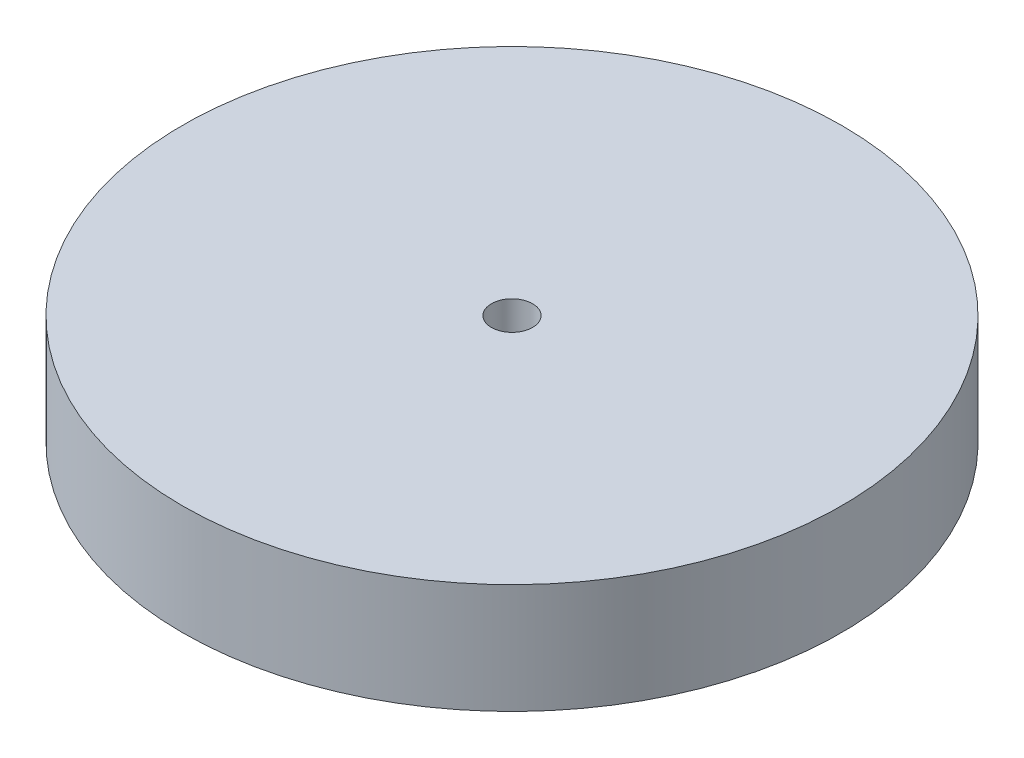
ISO-10303-21;
HEADER;
FILE_DESCRIPTION(('STEP AP214'),'2;1');
FILE_NAME('part.step','',(''),(''),'','','');
FILE_SCHEMA(('AUTOMOTIVE_DESIGN { 1 0 10303 214 1 1 1 1 }'));
ENDSEC;
DATA;
#1=APPLICATION_CONTEXT('core data for automotive mechanical design processes');
#2=APPLICATION_PROTOCOL_DEFINITION('international standard','automotive_design',2000,#1);
#3=PRODUCT_CONTEXT('',#1,'mechanical');
#4=PRODUCT('Part','Part','',(#3));
#5=PRODUCT_RELATED_PRODUCT_CATEGORY('part','',(#4));
#6=PRODUCT_DEFINITION_FORMATION('','',#4);
#7=PRODUCT_DEFINITION_CONTEXT('part definition',#1,'design');
#8=PRODUCT_DEFINITION('design','',#6,#7);
#9=PRODUCT_DEFINITION_SHAPE('','',#8);
#10=(LENGTH_UNIT() NAMED_UNIT(*) SI_UNIT(.MILLI.,.METRE.));
#11=(NAMED_UNIT(*) PLANE_ANGLE_UNIT() SI_UNIT($,.RADIAN.));
#12=(NAMED_UNIT(*) SI_UNIT($,.STERADIAN.) SOLID_ANGLE_UNIT());
#13=UNCERTAINTY_MEASURE_WITH_UNIT(LENGTH_MEASURE(1.E-05),#10,'distance_accuracy_value','');
#14=(GEOMETRIC_REPRESENTATION_CONTEXT(3) GLOBAL_UNCERTAINTY_ASSIGNED_CONTEXT((#13)) GLOBAL_UNIT_ASSIGNED_CONTEXT((#10,
#11,#12)) REPRESENTATION_CONTEXT('',''));
#15=CARTESIAN_POINT('',(0.,0.,0.));
#16=DIRECTION('',(0.,0.,1.));
#17=DIRECTION('',(1.,0.,0.));
#18=AXIS2_PLACEMENT_3D('',#15,#16,#17);
#19=CARTESIAN_POINT('',(76.2000000000007,12.7,0.));
#20=DIRECTION('',(0.,-1.,0.));
#21=DIRECTION('',(0.,0.,-1.));
#22=AXIS2_PLACEMENT_3D('',#19,#20,#21);
#23=PLANE('',#22);
#24=CARTESIAN_POINT('',(0.,12.6999999999997,0.));
#25=DIRECTION('',(0.,-1.,0.));
#26=DIRECTION('',(0.,0.,-1.));
#27=AXIS2_PLACEMENT_3D('',#24,#25,#26);
#28=CIRCLE('',#27,4.7625);
#29=CARTESIAN_POINT('',(0.,12.6999999999997,-4.7625));
#30=VERTEX_POINT('',#29);
#31=EDGE_CURVE('E41',#30,#30,#28,.T.);
#32=ORIENTED_EDGE('',*,*,#31,.T.);
#33=EDGE_LOOP('',(#32));
#34=FACE_BOUND('',#33,.T.);
#35=CARTESIAN_POINT('',(0.,12.6999999999997,0.));
#36=DIRECTION('',(0.,1.,0.));
#37=DIRECTION('',(0.,0.,1.));
#38=AXIS2_PLACEMENT_3D('',#35,#36,#37);
#39=CIRCLE('',#38,76.2000000000007);
#40=CARTESIAN_POINT('',(0.,12.6999999999997,76.2000000000007));
#41=VERTEX_POINT('',#40);
#42=EDGE_CURVE('E37',#41,#41,#39,.T.);
#43=ORIENTED_EDGE('',*,*,#42,.T.);
#44=EDGE_LOOP('',(#43));
#45=FACE_BOUND('',#44,.T.);
#46=ADVANCED_FACE('F31',(#34,#45),#23,.F.);
#47=CARTESIAN_POINT('',(76.2000000000007,-12.7,0.));
#48=DIRECTION('',(0.,1.,0.));
#49=DIRECTION('',(0.,0.,1.));
#50=AXIS2_PLACEMENT_3D('',#47,#48,#49);
#51=PLANE('',#50);
#52=CARTESIAN_POINT('',(0.,-12.7,0.));
#53=DIRECTION('',(0.,-1.,0.));
#54=DIRECTION('',(0.,0.,-1.));
#55=AXIS2_PLACEMENT_3D('',#52,#53,#54);
#56=CIRCLE('',#55,4.7625);
#57=CARTESIAN_POINT('',(0.,-12.7,-4.7625));
#58=VERTEX_POINT('',#57);
#59=EDGE_CURVE('E45',#58,#58,#56,.T.);
#60=ORIENTED_EDGE('',*,*,#59,.F.);
#61=EDGE_LOOP('',(#60));
#62=FACE_BOUND('',#61,.T.);
#63=CARTESIAN_POINT('',(0.,-12.6999999999997,0.));
#64=DIRECTION('',(0.,1.,0.));
#65=DIRECTION('',(0.,0.,1.));
#66=AXIS2_PLACEMENT_3D('',#63,#64,#65);
#67=CIRCLE('',#66,76.2000000000007);
#68=CARTESIAN_POINT('',(0.,-12.6999999999997,76.2000000000007));
#69=VERTEX_POINT('',#68);
#70=EDGE_CURVE('E10',#69,#69,#67,.T.);
#71=ORIENTED_EDGE('',*,*,#70,.F.);
#72=EDGE_LOOP('',(#71));
#73=FACE_BOUND('',#72,.T.);
#74=ADVANCED_FACE('F53',(#62,#73),#51,.F.);
#75=CARTESIAN_POINT('',(0.,5354.328,0.));
#76=DIRECTION('',(0.,1.,0.));
#77=DIRECTION('',(0.,0.,1.));
#78=AXIS2_PLACEMENT_3D('',#75,#76,#77);
#79=CYLINDRICAL_SURFACE('',#78,76.2000000000007);
#80=ORIENTED_EDGE('',*,*,#42,.F.);
#81=EDGE_LOOP('',(#80));
#82=FACE_BOUND('',#81,.T.);
#83=ORIENTED_EDGE('',*,*,#70,.T.);
#84=EDGE_LOOP('',(#83));
#85=FACE_BOUND('',#84,.T.);
#86=ADVANCED_FACE('F56',(#82,#85),#79,.T.);
#87=CARTESIAN_POINT('',(0.,12.6999999999997,0.));
#88=DIRECTION('',(0.,-1.,0.));
#89=DIRECTION('',(0.,0.,-1.));
#90=AXIS2_PLACEMENT_3D('',#87,#88,#89);
#91=CYLINDRICAL_SURFACE('',#90,4.7625);
#92=ORIENTED_EDGE('',*,*,#31,.F.);
#93=EDGE_LOOP('',(#92));
#94=FACE_BOUND('',#93,.T.);
#95=ORIENTED_EDGE('',*,*,#59,.T.);
#96=EDGE_LOOP('',(#95));
#97=FACE_BOUND('',#96,.T.);
#98=ADVANCED_FACE('F51',(#94,#97),#91,.F.);
#99=CLOSED_SHELL('',(#46,#74,#86,#98));
#100=MANIFOLD_SOLID_BREP('B2',#99);
#101=ADVANCED_BREP_SHAPE_REPRESENTATION('',(#18,#100),#14);
#102=SHAPE_DEFINITION_REPRESENTATION(#9,#101);
ENDSEC;
END-ISO-10303-21;
